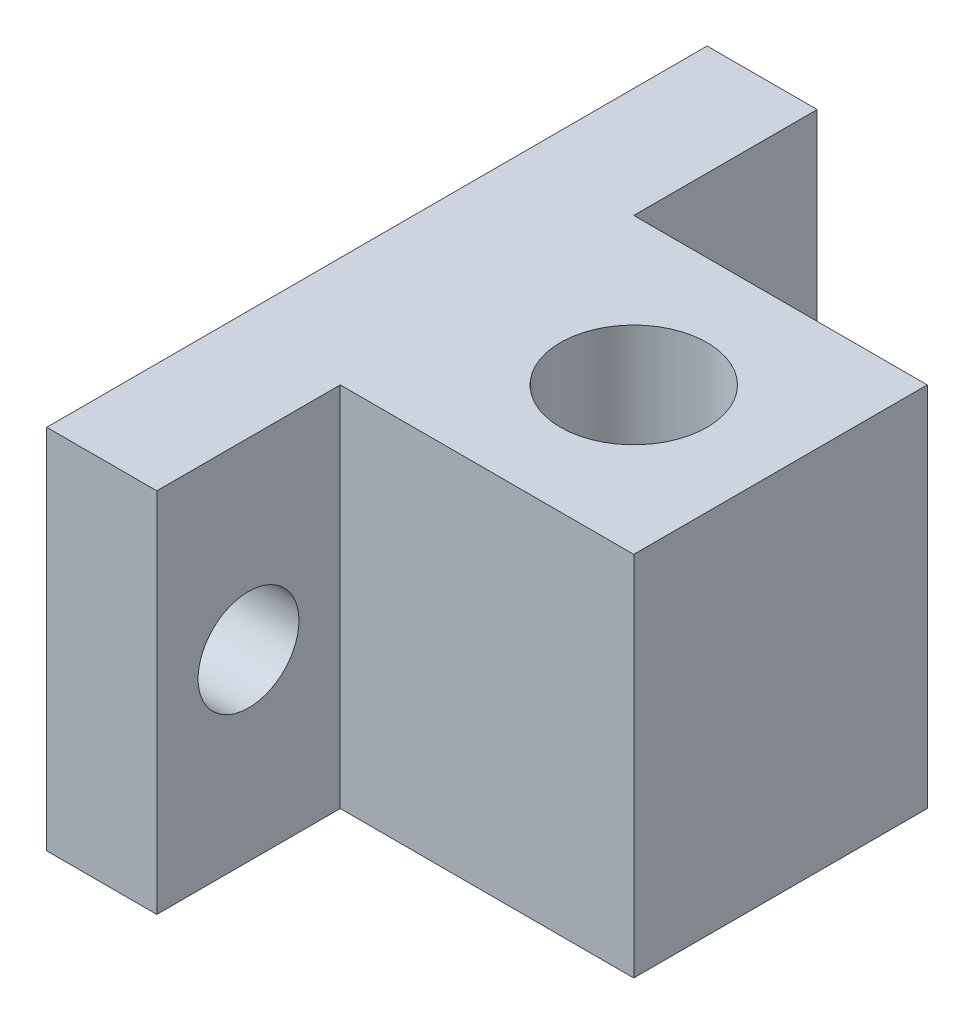
ISO-10303-21;
HEADER;
FILE_DESCRIPTION(('STEP AP214'),'2;1');
FILE_NAME('part.step','',(''),(''),'','','');
FILE_SCHEMA(('AUTOMOTIVE_DESIGN { 1 0 10303 214 1 1 1 1 }'));
ENDSEC;
DATA;
#1=APPLICATION_CONTEXT('core data for automotive mechanical design processes');
#2=APPLICATION_PROTOCOL_DEFINITION('international standard','automotive_design',2000,#1);
#3=PRODUCT_CONTEXT('',#1,'mechanical');
#4=PRODUCT('Part','Part','',(#3));
#5=PRODUCT_RELATED_PRODUCT_CATEGORY('part','',(#4));
#6=PRODUCT_DEFINITION_FORMATION('','',#4);
#7=PRODUCT_DEFINITION_CONTEXT('part definition',#1,'design');
#8=PRODUCT_DEFINITION('design','',#6,#7);
#9=PRODUCT_DEFINITION_SHAPE('','',#8);
#10=(LENGTH_UNIT() NAMED_UNIT(*) SI_UNIT(.MILLI.,.METRE.));
#11=(NAMED_UNIT(*) PLANE_ANGLE_UNIT() SI_UNIT($,.RADIAN.));
#12=(NAMED_UNIT(*) SI_UNIT($,.STERADIAN.) SOLID_ANGLE_UNIT());
#13=UNCERTAINTY_MEASURE_WITH_UNIT(LENGTH_MEASURE(1.E-05),#10,'distance_accuracy_value','');
#14=(GEOMETRIC_REPRESENTATION_CONTEXT(3) GLOBAL_UNCERTAINTY_ASSIGNED_CONTEXT((#13)) GLOBAL_UNIT_ASSIGNED_CONTEXT((#10,
#11,#12)) REPRESENTATION_CONTEXT('',''));
#15=CARTESIAN_POINT('',(0.,0.,0.));
#16=DIRECTION('',(0.,0.,1.));
#17=DIRECTION('',(1.,0.,0.));
#18=AXIS2_PLACEMENT_3D('',#15,#16,#17);
#19=CARTESIAN_POINT('',(0.,20.,0.));
#20=DIRECTION('',(0.,-1.,0.));
#21=DIRECTION('',(0.,0.,-1.));
#22=AXIS2_PLACEMENT_3D('',#19,#20,#21);
#23=PLANE('',#22);
#24=DIRECTION('',(1.,0.,0.));
#25=VECTOR('',#24,1.);
#26=CARTESIAN_POINT('',(6.,20.,0.));
#27=LINE('',#26,#25);
#28=CARTESIAN_POINT('',(0.,20.,0.));
#29=VERTEX_POINT('',#28);
#30=CARTESIAN_POINT('',(6.,20.,0.));
#31=VERTEX_POINT('',#30);
#32=EDGE_CURVE('E146',#29,#31,#27,.T.);
#33=ORIENTED_EDGE('',*,*,#32,.T.);
#34=DIRECTION('',(0.,0.,-1.));
#35=VECTOR('',#34,1.);
#36=CARTESIAN_POINT('',(6.,20.,-9.99999999999999));
#37=LINE('',#36,#35);
#38=CARTESIAN_POINT('',(6.,20.,-9.99999999999999));
#39=VERTEX_POINT('',#38);
#40=EDGE_CURVE('E94',#31,#39,#37,.T.);
#41=ORIENTED_EDGE('',*,*,#40,.T.);
#42=DIRECTION('',(1.,0.,0.));
#43=VECTOR('',#42,1.);
#44=CARTESIAN_POINT('',(22.,20.,-9.99999999999999));
#45=LINE('',#44,#43);
#46=CARTESIAN_POINT('',(22.,20.,-9.99999999999999));
#47=VERTEX_POINT('',#46);
#48=EDGE_CURVE('E177',#39,#47,#45,.T.);
#49=ORIENTED_EDGE('',*,*,#48,.T.);
#50=DIRECTION('',(0.,0.,-1.));
#51=VECTOR('',#50,1.);
#52=CARTESIAN_POINT('',(22.,20.,-26.));
#53=LINE('',#52,#51);
#54=CARTESIAN_POINT('',(22.,20.,-26.));
#55=VERTEX_POINT('',#54);
#56=EDGE_CURVE('E179',#47,#55,#53,.T.);
#57=ORIENTED_EDGE('',*,*,#56,.T.);
#58=DIRECTION('',(-1.,0.,0.));
#59=VECTOR('',#58,1.);
#60=CARTESIAN_POINT('',(6.,20.,-26.));
#61=LINE('',#60,#59);
#62=CARTESIAN_POINT('',(6.,20.,-26.));
#63=VERTEX_POINT('',#62);
#64=EDGE_CURVE('E113',#55,#63,#61,.T.);
#65=ORIENTED_EDGE('',*,*,#64,.T.);
#66=DIRECTION('',(0.,0.,-1.));
#67=VECTOR('',#66,1.);
#68=CARTESIAN_POINT('',(6.,20.,-36.));
#69=LINE('',#68,#67);
#70=CARTESIAN_POINT('',(6.,20.,-36.));
#71=VERTEX_POINT('',#70);
#72=EDGE_CURVE('E107',#63,#71,#69,.T.);
#73=ORIENTED_EDGE('',*,*,#72,.T.);
#74=DIRECTION('',(-1.,0.,0.));
#75=VECTOR('',#74,1.);
#76=CARTESIAN_POINT('',(0.,20.,-36.));
#77=LINE('',#76,#75);
#78=CARTESIAN_POINT('',(0.,20.,-36.));
#79=VERTEX_POINT('',#78);
#80=EDGE_CURVE('E111',#71,#79,#77,.T.);
#81=ORIENTED_EDGE('',*,*,#80,.T.);
#82=DIRECTION('',(0.,0.,1.));
#83=VECTOR('',#82,1.);
#84=CARTESIAN_POINT('',(0.,20.,0.));
#85=LINE('',#84,#83);
#86=EDGE_CURVE('E51',#79,#29,#85,.T.);
#87=ORIENTED_EDGE('',*,*,#86,.T.);
#88=EDGE_LOOP('',(#33,#41,#49,#57,#65,#73,#81,#87));
#89=FACE_BOUND('',#88,.T.);
#90=CARTESIAN_POINT('',(14.,20.,-18.));
#91=DIRECTION('',(0.,1.,0.));
#92=DIRECTION('',(0.,0.,1.));
#93=AXIS2_PLACEMENT_3D('',#90,#91,#92);
#94=CIRCLE('',#93,4.);
#95=CARTESIAN_POINT('',(14.,20.,-14.));
#96=VERTEX_POINT('',#95);
#97=EDGE_CURVE('E135',#96,#96,#94,.T.);
#98=ORIENTED_EDGE('',*,*,#97,.F.);
#99=EDGE_LOOP('',(#98));
#100=FACE_BOUND('',#99,.T.);
#101=ADVANCED_FACE('F32',(#89,#100),#23,.F.);
#102=CARTESIAN_POINT('',(0.,0.,0.));
#103=DIRECTION('',(0.,-1.,0.));
#104=DIRECTION('',(0.,0.,-1.));
#105=AXIS2_PLACEMENT_3D('',#102,#103,#104);
#106=PLANE('',#105);
#107=DIRECTION('',(1.,0.,0.));
#108=VECTOR('',#107,1.);
#109=CARTESIAN_POINT('',(6.,0.,0.));
#110=LINE('',#109,#108);
#111=CARTESIAN_POINT('',(0.,0.,0.));
#112=VERTEX_POINT('',#111);
#113=CARTESIAN_POINT('',(6.,0.,0.));
#114=VERTEX_POINT('',#113);
#115=EDGE_CURVE('E131',#112,#114,#110,.T.);
#116=ORIENTED_EDGE('',*,*,#115,.F.);
#117=DIRECTION('',(0.,0.,1.));
#118=VECTOR('',#117,1.);
#119=CARTESIAN_POINT('',(0.,0.,0.));
#120=LINE('',#119,#118);
#121=CARTESIAN_POINT('',(0.,0.,-36.));
#122=VERTEX_POINT('',#121);
#123=EDGE_CURVE('E86',#122,#112,#120,.T.);
#124=ORIENTED_EDGE('',*,*,#123,.F.);
#125=DIRECTION('',(-1.,0.,0.));
#126=VECTOR('',#125,1.);
#127=CARTESIAN_POINT('',(0.,0.,-36.));
#128=LINE('',#127,#126);
#129=CARTESIAN_POINT('',(6.,0.,-36.));
#130=VERTEX_POINT('',#129);
#131=EDGE_CURVE('E80',#130,#122,#128,.T.);
#132=ORIENTED_EDGE('',*,*,#131,.F.);
#133=DIRECTION('',(0.,0.,-1.));
#134=VECTOR('',#133,1.);
#135=CARTESIAN_POINT('',(6.,0.,-36.));
#136=LINE('',#135,#134);
#137=CARTESIAN_POINT('',(6.,0.,-26.));
#138=VERTEX_POINT('',#137);
#139=EDGE_CURVE('E121',#138,#130,#136,.T.);
#140=ORIENTED_EDGE('',*,*,#139,.F.);
#141=DIRECTION('',(-1.,0.,0.));
#142=VECTOR('',#141,1.);
#143=CARTESIAN_POINT('',(6.,0.,-26.));
#144=LINE('',#143,#142);
#145=CARTESIAN_POINT('',(22.,0.,-26.));
#146=VERTEX_POINT('',#145);
#147=EDGE_CURVE('E141',#146,#138,#144,.T.);
#148=ORIENTED_EDGE('',*,*,#147,.F.);
#149=DIRECTION('',(0.,0.,-1.));
#150=VECTOR('',#149,1.);
#151=CARTESIAN_POINT('',(22.,0.,-26.));
#152=LINE('',#151,#150);
#153=CARTESIAN_POINT('',(22.,0.,-9.99999999999999));
#154=VERTEX_POINT('',#153);
#155=EDGE_CURVE('E139',#154,#146,#152,.T.);
#156=ORIENTED_EDGE('',*,*,#155,.F.);
#157=DIRECTION('',(1.,0.,0.));
#158=VECTOR('',#157,1.);
#159=CARTESIAN_POINT('',(22.,0.,-9.99999999999999));
#160=LINE('',#159,#158);
#161=CARTESIAN_POINT('',(6.,0.,-9.99999999999999));
#162=VERTEX_POINT('',#161);
#163=EDGE_CURVE('E137',#162,#154,#160,.T.);
#164=ORIENTED_EDGE('',*,*,#163,.F.);
#165=DIRECTION('',(0.,0.,-1.));
#166=VECTOR('',#165,1.);
#167=CARTESIAN_POINT('',(6.,0.,-9.99999999999999));
#168=LINE('',#167,#166);
#169=EDGE_CURVE('E134',#114,#162,#168,.T.);
#170=ORIENTED_EDGE('',*,*,#169,.F.);
#171=EDGE_LOOP('',(#116,#124,#132,#140,#148,#156,#164,#170));
#172=FACE_BOUND('',#171,.T.);
#173=CARTESIAN_POINT('',(14.,0.,-18.));
#174=DIRECTION('',(0.,1.,0.));
#175=DIRECTION('',(0.,0.,1.));
#176=AXIS2_PLACEMENT_3D('',#173,#174,#175);
#177=CIRCLE('',#176,4.);
#178=CARTESIAN_POINT('',(14.,0.,-14.));
#179=VERTEX_POINT('',#178);
#180=EDGE_CURVE('E159',#179,#179,#177,.T.);
#181=ORIENTED_EDGE('',*,*,#180,.T.);
#182=EDGE_LOOP('',(#181));
#183=FACE_BOUND('',#182,.T.);
#184=ADVANCED_FACE('F192',(#172,#183),#106,.T.);
#185=CARTESIAN_POINT('',(6.,20.,0.));
#186=DIRECTION('',(0.,0.,-1.));
#187=DIRECTION('',(-1.,0.,0.));
#188=AXIS2_PLACEMENT_3D('',#185,#186,#187);
#189=PLANE('',#188);
#190=ORIENTED_EDGE('',*,*,#115,.T.);
#191=DIRECTION('',(0.,-1.,0.));
#192=VECTOR('',#191,1.);
#193=CARTESIAN_POINT('',(6.,20.,0.));
#194=LINE('',#193,#192);
#195=EDGE_CURVE('E11',#31,#114,#194,.T.);
#196=ORIENTED_EDGE('',*,*,#195,.F.);
#197=ORIENTED_EDGE('',*,*,#32,.F.);
#198=DIRECTION('',(0.,-1.,0.));
#199=VECTOR('',#198,1.);
#200=CARTESIAN_POINT('',(0.,20.,0.));
#201=LINE('',#200,#199);
#202=EDGE_CURVE('E127',#29,#112,#201,.T.);
#203=ORIENTED_EDGE('',*,*,#202,.T.);
#204=EDGE_LOOP('',(#190,#196,#197,#203));
#205=FACE_BOUND('',#204,.T.);
#206=ADVANCED_FACE('F34',(#205),#189,.F.);
#207=CARTESIAN_POINT('',(6.,20.,-9.99999999999999));
#208=DIRECTION('',(-1.,0.,0.));
#209=DIRECTION('',(0.,0.,1.));
#210=AXIS2_PLACEMENT_3D('',#207,#208,#209);
#211=PLANE('',#210);
#212=CARTESIAN_POINT('',(6.,10.,-5.00000000000001));
#213=DIRECTION('',(1.,0.,0.));
#214=DIRECTION('',(0.,0.,-1.));
#215=AXIS2_PLACEMENT_3D('',#212,#213,#214);
#216=CIRCLE('',#215,2.75);
#217=CARTESIAN_POINT('',(6.,10.,-7.75));
#218=VERTEX_POINT('',#217);
#219=EDGE_CURVE('E160',#218,#218,#216,.T.);
#220=ORIENTED_EDGE('',*,*,#219,.F.);
#221=EDGE_LOOP('',(#220));
#222=FACE_BOUND('',#221,.T.);
#223=ORIENTED_EDGE('',*,*,#169,.T.);
#224=DIRECTION('',(0.,-1.,0.));
#225=VECTOR('',#224,1.);
#226=CARTESIAN_POINT('',(6.,20.,-9.99999999999999));
#227=LINE('',#226,#225);
#228=EDGE_CURVE('E42',#39,#162,#227,.T.);
#229=ORIENTED_EDGE('',*,*,#228,.F.);
#230=ORIENTED_EDGE('',*,*,#40,.F.);
#231=ORIENTED_EDGE('',*,*,#195,.T.);
#232=EDGE_LOOP('',(#223,#229,#230,#231));
#233=FACE_BOUND('',#232,.T.);
#234=ADVANCED_FACE('F241',(#222,#233),#211,.F.);
#235=CARTESIAN_POINT('',(22.,20.,-9.99999999999999));
#236=DIRECTION('',(0.,0.,-1.));
#237=DIRECTION('',(-1.,0.,0.));
#238=AXIS2_PLACEMENT_3D('',#235,#236,#237);
#239=PLANE('',#238);
#240=ORIENTED_EDGE('',*,*,#163,.T.);
#241=DIRECTION('',(0.,-1.,0.));
#242=VECTOR('',#241,1.);
#243=CARTESIAN_POINT('',(22.,20.,-9.99999999999999));
#244=LINE('',#243,#242);
#245=EDGE_CURVE('E153',#47,#154,#244,.T.);
#246=ORIENTED_EDGE('',*,*,#245,.F.);
#247=ORIENTED_EDGE('',*,*,#48,.F.);
#248=ORIENTED_EDGE('',*,*,#228,.T.);
#249=EDGE_LOOP('',(#240,#246,#247,#248));
#250=FACE_BOUND('',#249,.T.);
#251=ADVANCED_FACE('F239',(#250),#239,.F.);
#252=CARTESIAN_POINT('',(22.,20.,-26.));
#253=DIRECTION('',(-1.,0.,0.));
#254=DIRECTION('',(0.,0.,1.));
#255=AXIS2_PLACEMENT_3D('',#252,#253,#254);
#256=PLANE('',#255);
#257=ORIENTED_EDGE('',*,*,#155,.T.);
#258=DIRECTION('',(0.,-1.,0.));
#259=VECTOR('',#258,1.);
#260=CARTESIAN_POINT('',(22.,20.,-26.));
#261=LINE('',#260,#259);
#262=EDGE_CURVE('E150',#55,#146,#261,.T.);
#263=ORIENTED_EDGE('',*,*,#262,.F.);
#264=ORIENTED_EDGE('',*,*,#56,.F.);
#265=ORIENTED_EDGE('',*,*,#245,.T.);
#266=EDGE_LOOP('',(#257,#263,#264,#265));
#267=FACE_BOUND('',#266,.T.);
#268=ADVANCED_FACE('F185',(#267),#256,.F.);
#269=CARTESIAN_POINT('',(6.,20.,-26.));
#270=DIRECTION('',(0.,0.,1.));
#271=DIRECTION('',(1.,0.,0.));
#272=AXIS2_PLACEMENT_3D('',#269,#270,#271);
#273=PLANE('',#272);
#274=ORIENTED_EDGE('',*,*,#147,.T.);
#275=DIRECTION('',(0.,-1.,0.));
#276=VECTOR('',#275,1.);
#277=CARTESIAN_POINT('',(6.,20.,-26.));
#278=LINE('',#277,#276);
#279=EDGE_CURVE('E122',#63,#138,#278,.T.);
#280=ORIENTED_EDGE('',*,*,#279,.F.);
#281=ORIENTED_EDGE('',*,*,#64,.F.);
#282=ORIENTED_EDGE('',*,*,#262,.T.);
#283=EDGE_LOOP('',(#274,#280,#281,#282));
#284=FACE_BOUND('',#283,.T.);
#285=ADVANCED_FACE('F189',(#284),#273,.F.);
#286=CARTESIAN_POINT('',(6.,20.,-36.));
#287=DIRECTION('',(-1.,0.,0.));
#288=DIRECTION('',(0.,0.,1.));
#289=AXIS2_PLACEMENT_3D('',#286,#287,#288);
#290=PLANE('',#289);
#291=CARTESIAN_POINT('',(5.99999999999999,10.,-31.));
#292=DIRECTION('',(1.,0.,0.));
#293=DIRECTION('',(0.,0.,-1.));
#294=AXIS2_PLACEMENT_3D('',#291,#292,#293);
#295=CIRCLE('',#294,2.74999999999999);
#296=CARTESIAN_POINT('',(5.99999999999999,10.,-33.75));
#297=VERTEX_POINT('',#296);
#298=EDGE_CURVE('E170',#297,#297,#295,.T.);
#299=ORIENTED_EDGE('',*,*,#298,.F.);
#300=EDGE_LOOP('',(#299));
#301=FACE_BOUND('',#300,.T.);
#302=ORIENTED_EDGE('',*,*,#139,.T.);
#303=DIRECTION('',(0.,-1.,0.));
#304=VECTOR('',#303,1.);
#305=CARTESIAN_POINT('',(6.,20.,-36.));
#306=LINE('',#305,#304);
#307=EDGE_CURVE('E118',#71,#130,#306,.T.);
#308=ORIENTED_EDGE('',*,*,#307,.F.);
#309=ORIENTED_EDGE('',*,*,#72,.F.);
#310=ORIENTED_EDGE('',*,*,#279,.T.);
#311=EDGE_LOOP('',(#302,#308,#309,#310));
#312=FACE_BOUND('',#311,.T.);
#313=ADVANCED_FACE('F119',(#301,#312),#290,.F.);
#314=CARTESIAN_POINT('',(0.,20.,-36.));
#315=DIRECTION('',(0.,0.,1.));
#316=DIRECTION('',(1.,0.,0.));
#317=AXIS2_PLACEMENT_3D('',#314,#315,#316);
#318=PLANE('',#317);
#319=ORIENTED_EDGE('',*,*,#131,.T.);
#320=DIRECTION('',(0.,-1.,0.));
#321=VECTOR('',#320,1.);
#322=CARTESIAN_POINT('',(0.,20.,-36.));
#323=LINE('',#322,#321);
#324=EDGE_CURVE('E123',#79,#122,#323,.T.);
#325=ORIENTED_EDGE('',*,*,#324,.F.);
#326=ORIENTED_EDGE('',*,*,#80,.F.);
#327=ORIENTED_EDGE('',*,*,#307,.T.);
#328=EDGE_LOOP('',(#319,#325,#326,#327));
#329=FACE_BOUND('',#328,.T.);
#330=ADVANCED_FACE('F125',(#329),#318,.F.);
#331=CARTESIAN_POINT('',(0.,20.,0.));
#332=DIRECTION('',(1.,0.,0.));
#333=DIRECTION('',(0.,0.,-1.));
#334=AXIS2_PLACEMENT_3D('',#331,#332,#333);
#335=PLANE('',#334);
#336=CARTESIAN_POINT('',(0.,10.,-31.));
#337=DIRECTION('',(1.,0.,0.));
#338=DIRECTION('',(0.,0.,-1.));
#339=AXIS2_PLACEMENT_3D('',#336,#337,#338);
#340=CIRCLE('',#339,2.74999999999999);
#341=CARTESIAN_POINT('',(0.,10.,-33.75));
#342=VERTEX_POINT('',#341);
#343=EDGE_CURVE('E36',#342,#342,#340,.T.);
#344=ORIENTED_EDGE('',*,*,#343,.T.);
#345=EDGE_LOOP('',(#344));
#346=FACE_BOUND('',#345,.T.);
#347=CARTESIAN_POINT('',(0.,10.,-5.));
#348=DIRECTION('',(1.,0.,0.));
#349=DIRECTION('',(0.,0.,-1.));
#350=AXIS2_PLACEMENT_3D('',#347,#348,#349);
#351=CIRCLE('',#350,2.75);
#352=CARTESIAN_POINT('',(0.,10.,-7.75));
#353=VERTEX_POINT('',#352);
#354=EDGE_CURVE('E157',#353,#353,#351,.T.);
#355=ORIENTED_EDGE('',*,*,#354,.T.);
#356=EDGE_LOOP('',(#355));
#357=FACE_BOUND('',#356,.T.);
#358=ORIENTED_EDGE('',*,*,#123,.T.);
#359=ORIENTED_EDGE('',*,*,#202,.F.);
#360=ORIENTED_EDGE('',*,*,#86,.F.);
#361=ORIENTED_EDGE('',*,*,#324,.T.);
#362=EDGE_LOOP('',(#358,#359,#360,#361));
#363=FACE_BOUND('',#362,.T.);
#364=ADVANCED_FACE('F198',(#346,#357,#363),#335,.F.);
#365=CARTESIAN_POINT('',(14.,20.,-18.));
#366=DIRECTION('',(0.,-1.,0.));
#367=DIRECTION('',(0.,0.,-1.));
#368=AXIS2_PLACEMENT_3D('',#365,#366,#367);
#369=CYLINDRICAL_SURFACE('',#368,4.);
#370=ORIENTED_EDGE('',*,*,#97,.T.);
#371=EDGE_LOOP('',(#370));
#372=FACE_BOUND('',#371,.T.);
#373=ORIENTED_EDGE('',*,*,#180,.F.);
#374=EDGE_LOOP('',(#373));
#375=FACE_BOUND('',#374,.T.);
#376=ADVANCED_FACE('F200',(#372,#375),#369,.F.);
#377=CARTESIAN_POINT('',(-4.,10.,-5.));
#378=DIRECTION('',(1.,0.,0.));
#379=DIRECTION('',(0.,0.,-1.));
#380=AXIS2_PLACEMENT_3D('',#377,#378,#379);
#381=CYLINDRICAL_SURFACE('',#380,2.75);
#382=ORIENTED_EDGE('',*,*,#219,.T.);
#383=EDGE_LOOP('',(#382));
#384=FACE_BOUND('',#383,.T.);
#385=ORIENTED_EDGE('',*,*,#354,.F.);
#386=EDGE_LOOP('',(#385));
#387=FACE_BOUND('',#386,.T.);
#388=ADVANCED_FACE('F207',(#384,#387),#381,.F.);
#389=CARTESIAN_POINT('',(-4.00000000000001,10.,-31.));
#390=DIRECTION('',(1.,0.,0.));
#391=DIRECTION('',(0.,0.,-1.));
#392=AXIS2_PLACEMENT_3D('',#389,#390,#391);
#393=CYLINDRICAL_SURFACE('',#392,2.74999999999999);
#394=ORIENTED_EDGE('',*,*,#298,.T.);
#395=EDGE_LOOP('',(#394));
#396=FACE_BOUND('',#395,.T.);
#397=ORIENTED_EDGE('',*,*,#343,.F.);
#398=EDGE_LOOP('',(#397));
#399=FACE_BOUND('',#398,.T.);
#400=ADVANCED_FACE('F220',(#396,#399),#393,.F.);
#401=CLOSED_SHELL('',(#101,#184,#206,#234,#251,#268,#285,#313,#330,#364,#376,#388,#400));
#402=MANIFOLD_SOLID_BREP('B2',#401);
#403=ADVANCED_BREP_SHAPE_REPRESENTATION('',(#18,#402),#14);
#404=SHAPE_DEFINITION_REPRESENTATION(#9,#403);
ENDSEC;
END-ISO-10303-21;
